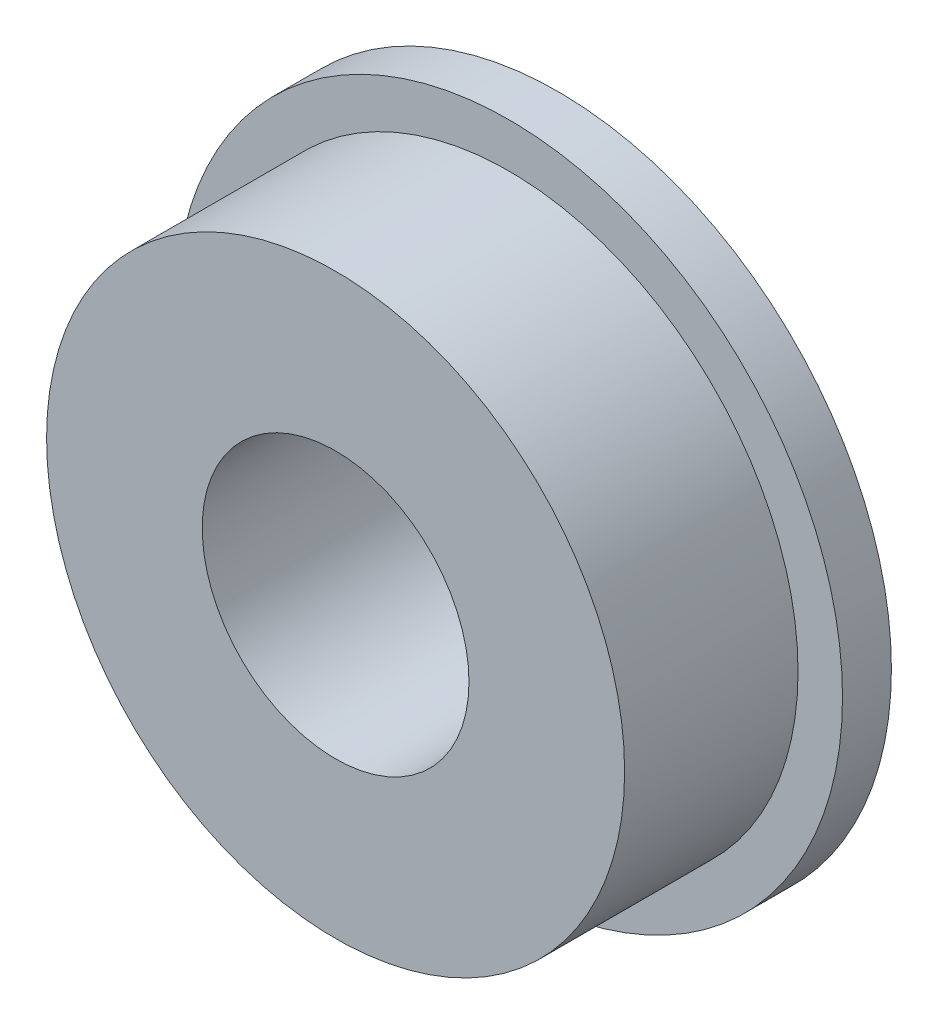
ISO-10303-21;
HEADER;
FILE_DESCRIPTION(('STEP AP214'),'2;1');
FILE_NAME('part.step','',(''),(''),'','','');
FILE_SCHEMA(('AUTOMOTIVE_DESIGN { 1 0 10303 214 1 1 1 1 }'));
ENDSEC;
DATA;
#1=APPLICATION_CONTEXT('core data for automotive mechanical design processes');
#2=APPLICATION_PROTOCOL_DEFINITION('international standard','automotive_design',2000,#1);
#3=PRODUCT_CONTEXT('',#1,'mechanical');
#4=PRODUCT('Part','Part','',(#3));
#5=PRODUCT_RELATED_PRODUCT_CATEGORY('part','',(#4));
#6=PRODUCT_DEFINITION_FORMATION('','',#4);
#7=PRODUCT_DEFINITION_CONTEXT('part definition',#1,'design');
#8=PRODUCT_DEFINITION('design','',#6,#7);
#9=PRODUCT_DEFINITION_SHAPE('','',#8);
#10=(LENGTH_UNIT() NAMED_UNIT(*) SI_UNIT(.MILLI.,.METRE.));
#11=(NAMED_UNIT(*) PLANE_ANGLE_UNIT() SI_UNIT($,.RADIAN.));
#12=(NAMED_UNIT(*) SI_UNIT($,.STERADIAN.) SOLID_ANGLE_UNIT());
#13=UNCERTAINTY_MEASURE_WITH_UNIT(LENGTH_MEASURE(1.E-05),#10,'distance_accuracy_value','');
#14=(GEOMETRIC_REPRESENTATION_CONTEXT(3) GLOBAL_UNCERTAINTY_ASSIGNED_CONTEXT((#13)) GLOBAL_UNIT_ASSIGNED_CONTEXT((#10,
#11,#12)) REPRESENTATION_CONTEXT('',''));
#15=CARTESIAN_POINT('',(0.,0.,0.));
#16=DIRECTION('',(0.,0.,1.));
#17=DIRECTION('',(1.,0.,0.));
#18=AXIS2_PLACEMENT_3D('',#15,#16,#17);
#19=CARTESIAN_POINT('',(6.5,0.,-3.9));
#20=DIRECTION('',(0.,0.,1.));
#21=DIRECTION('',(1.,0.,0.));
#22=AXIS2_PLACEMENT_3D('',#19,#20,#21);
#23=PLANE('',#22);
#24=CARTESIAN_POINT('',(0.,0.,-3.9));
#25=DIRECTION('',(0.,0.,1.));
#26=DIRECTION('',(1.,0.,0.));
#27=AXIS2_PLACEMENT_3D('',#24,#25,#26);
#28=CIRCLE('',#27,7.5);
#29=CARTESIAN_POINT('',(7.5,0.,-3.9));
#30=VERTEX_POINT('',#29);
#31=EDGE_CURVE('E10',#30,#30,#28,.T.);
#32=ORIENTED_EDGE('',*,*,#31,.T.);
#33=EDGE_LOOP('',(#32));
#34=FACE_BOUND('',#33,.T.);
#35=CARTESIAN_POINT('',(0.,0.,-3.9));
#36=DIRECTION('',(0.,0.,1.));
#37=DIRECTION('',(1.,0.,0.));
#38=AXIS2_PLACEMENT_3D('',#35,#36,#37);
#39=CIRCLE('',#38,6.5);
#40=CARTESIAN_POINT('',(6.5,0.,-3.9));
#41=VERTEX_POINT('',#40);
#42=EDGE_CURVE('E61',#41,#41,#39,.T.);
#43=ORIENTED_EDGE('',*,*,#42,.F.);
#44=EDGE_LOOP('',(#43));
#45=FACE_BOUND('',#44,.T.);
#46=ADVANCED_FACE('F39',(#34,#45),#23,.T.);
#47=CARTESIAN_POINT('',(0.,0.,0.));
#48=DIRECTION('',(0.,0.,1.));
#49=DIRECTION('',(1.,0.,0.));
#50=AXIS2_PLACEMENT_3D('',#47,#48,#49);
#51=CYLINDRICAL_SURFACE('',#50,7.5);
#52=CARTESIAN_POINT('',(0.,0.,-5.));
#53=DIRECTION('',(0.,0.,1.));
#54=DIRECTION('',(1.,0.,0.));
#55=AXIS2_PLACEMENT_3D('',#52,#53,#54);
#56=CIRCLE('',#55,7.5);
#57=CARTESIAN_POINT('',(7.5,0.,-5.));
#58=VERTEX_POINT('',#57);
#59=EDGE_CURVE('E45',#58,#58,#56,.T.);
#60=ORIENTED_EDGE('',*,*,#59,.T.);
#61=EDGE_LOOP('',(#60));
#62=FACE_BOUND('',#61,.T.);
#63=ORIENTED_EDGE('',*,*,#31,.F.);
#64=EDGE_LOOP('',(#63));
#65=FACE_BOUND('',#64,.T.);
#66=ADVANCED_FACE('F69',(#62,#65),#51,.T.);
#67=CARTESIAN_POINT('',(7.5,0.,-5.));
#68=DIRECTION('',(0.,0.,-1.));
#69=DIRECTION('',(-1.,0.,0.));
#70=AXIS2_PLACEMENT_3D('',#67,#68,#69);
#71=PLANE('',#70);
#72=CARTESIAN_POINT('',(0.,0.,-5.));
#73=DIRECTION('',(0.,0.,1.));
#74=DIRECTION('',(1.,0.,0.));
#75=AXIS2_PLACEMENT_3D('',#72,#73,#74);
#76=CIRCLE('',#75,3.);
#77=CARTESIAN_POINT('',(3.,0.,-5.));
#78=VERTEX_POINT('',#77);
#79=EDGE_CURVE('E49',#78,#78,#76,.T.);
#80=ORIENTED_EDGE('',*,*,#79,.T.);
#81=EDGE_LOOP('',(#80));
#82=FACE_BOUND('',#81,.T.);
#83=ORIENTED_EDGE('',*,*,#59,.F.);
#84=EDGE_LOOP('',(#83));
#85=FACE_BOUND('',#84,.T.);
#86=ADVANCED_FACE('F73',(#82,#85),#71,.T.);
#87=CARTESIAN_POINT('',(0.,0.,0.));
#88=DIRECTION('',(0.,0.,1.));
#89=DIRECTION('',(1.,0.,0.));
#90=AXIS2_PLACEMENT_3D('',#87,#88,#89);
#91=CYLINDRICAL_SURFACE('',#90,3.);
#92=CARTESIAN_POINT('',(0.,0.,0.));
#93=DIRECTION('',(0.,0.,1.));
#94=DIRECTION('',(1.,0.,0.));
#95=AXIS2_PLACEMENT_3D('',#92,#93,#94);
#96=CIRCLE('',#95,3.);
#97=CARTESIAN_POINT('',(3.,0.,0.));
#98=VERTEX_POINT('',#97);
#99=EDGE_CURVE('E53',#98,#98,#96,.T.);
#100=ORIENTED_EDGE('',*,*,#99,.T.);
#101=EDGE_LOOP('',(#100));
#102=FACE_BOUND('',#101,.T.);
#103=ORIENTED_EDGE('',*,*,#79,.F.);
#104=EDGE_LOOP('',(#103));
#105=FACE_BOUND('',#104,.T.);
#106=ADVANCED_FACE('F77',(#102,#105),#91,.F.);
#107=CARTESIAN_POINT('',(3.,0.,0.));
#108=DIRECTION('',(0.,0.,1.));
#109=DIRECTION('',(1.,0.,0.));
#110=AXIS2_PLACEMENT_3D('',#107,#108,#109);
#111=PLANE('',#110);
#112=CARTESIAN_POINT('',(0.,0.,0.));
#113=DIRECTION('',(0.,0.,1.));
#114=DIRECTION('',(1.,0.,0.));
#115=AXIS2_PLACEMENT_3D('',#112,#113,#114);
#116=CIRCLE('',#115,6.5);
#117=CARTESIAN_POINT('',(6.5,0.,0.));
#118=VERTEX_POINT('',#117);
#119=EDGE_CURVE('E58',#118,#118,#116,.T.);
#120=ORIENTED_EDGE('',*,*,#119,.T.);
#121=EDGE_LOOP('',(#120));
#122=FACE_BOUND('',#121,.T.);
#123=ORIENTED_EDGE('',*,*,#99,.F.);
#124=EDGE_LOOP('',(#123));
#125=FACE_BOUND('',#124,.T.);
#126=ADVANCED_FACE('F84',(#122,#125),#111,.T.);
#127=CARTESIAN_POINT('',(0.,0.,0.));
#128=DIRECTION('',(0.,0.,1.));
#129=DIRECTION('',(1.,0.,0.));
#130=AXIS2_PLACEMENT_3D('',#127,#128,#129);
#131=CYLINDRICAL_SURFACE('',#130,6.5);
#132=ORIENTED_EDGE('',*,*,#42,.T.);
#133=EDGE_LOOP('',(#132));
#134=FACE_BOUND('',#133,.T.);
#135=ORIENTED_EDGE('',*,*,#119,.F.);
#136=EDGE_LOOP('',(#135));
#137=FACE_BOUND('',#136,.T.);
#138=ADVANCED_FACE('F65',(#134,#137),#131,.T.);
#139=CLOSED_SHELL('',(#46,#66,#86,#106,#126,#138));
#140=MANIFOLD_SOLID_BREP('B2',#139);
#141=ADVANCED_BREP_SHAPE_REPRESENTATION('',(#18,#140),#14);
#142=SHAPE_DEFINITION_REPRESENTATION(#9,#141);
ENDSEC;
END-ISO-10303-21;
